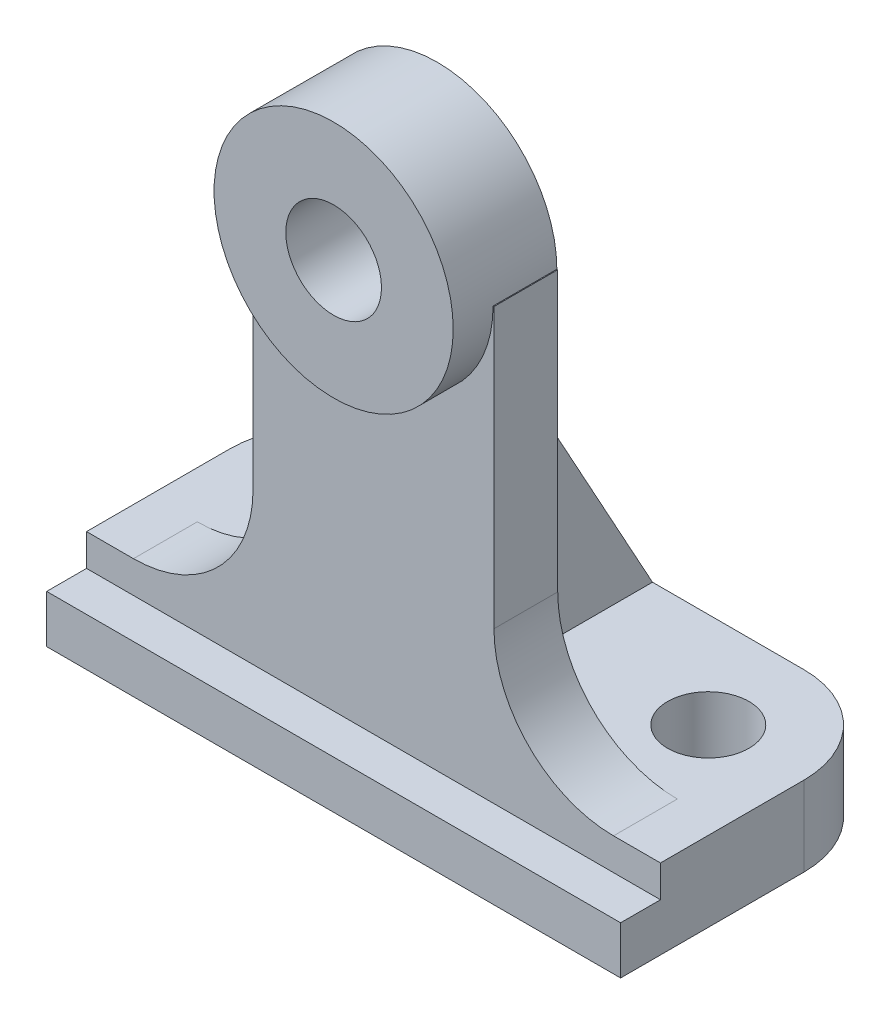
ISO-10303-21;
HEADER;
FILE_DESCRIPTION(('STEP AP214'),'2;1');
FILE_NAME('part.step','',(''),(''),'','','');
FILE_SCHEMA(('AUTOMOTIVE_DESIGN { 1 0 10303 214 1 1 1 1 }'));
ENDSEC;
DATA;
#1=APPLICATION_CONTEXT('core data for automotive mechanical design processes');
#2=APPLICATION_PROTOCOL_DEFINITION('international standard','automotive_design',2000,#1);
#3=PRODUCT_CONTEXT('',#1,'mechanical');
#4=PRODUCT('Part','Part','',(#3));
#5=PRODUCT_RELATED_PRODUCT_CATEGORY('part','',(#4));
#6=PRODUCT_DEFINITION_FORMATION('','',#4);
#7=PRODUCT_DEFINITION_CONTEXT('part definition',#1,'design');
#8=PRODUCT_DEFINITION('design','',#6,#7);
#9=PRODUCT_DEFINITION_SHAPE('','',#8);
#10=(LENGTH_UNIT() NAMED_UNIT(*) SI_UNIT(.MILLI.,.METRE.));
#11=(NAMED_UNIT(*) PLANE_ANGLE_UNIT() SI_UNIT($,.RADIAN.));
#12=(NAMED_UNIT(*) SI_UNIT($,.STERADIAN.) SOLID_ANGLE_UNIT());
#13=UNCERTAINTY_MEASURE_WITH_UNIT(LENGTH_MEASURE(1.E-05),#10,'distance_accuracy_value','');
#14=(GEOMETRIC_REPRESENTATION_CONTEXT(3) GLOBAL_UNCERTAINTY_ASSIGNED_CONTEXT((#13)) GLOBAL_UNIT_ASSIGNED_CONTEXT((#10,
#11,#12)) REPRESENTATION_CONTEXT('',''));
#15=CARTESIAN_POINT('',(0.,0.,0.));
#16=DIRECTION('',(0.,0.,1.));
#17=DIRECTION('',(1.,0.,0.));
#18=AXIS2_PLACEMENT_3D('',#15,#16,#17);
#19=CARTESIAN_POINT('',(-36.,5.,0.));
#20=DIRECTION('',(0.,1.,0.));
#21=DIRECTION('',(0.,0.,1.));
#22=AXIS2_PLACEMENT_3D('',#19,#20,#21);
#23=PLANE('',#22);
#24=CARTESIAN_POINT('',(-24.,5.,-5.5));
#25=DIRECTION('',(0.,1.,0.));
#26=DIRECTION('',(0.,0.,1.));
#27=AXIS2_PLACEMENT_3D('',#24,#25,#26);
#28=CIRCLE('',#27,5.1);
#29=CARTESIAN_POINT('',(-24.,5.,-0.400000000000001));
#30=VERTEX_POINT('',#29);
#31=EDGE_CURVE('E204',#30,#30,#28,.T.);
#32=ORIENTED_EDGE('',*,*,#31,.F.);
#33=EDGE_LOOP('',(#32));
#34=FACE_BOUND('',#33,.T.);
#35=DIRECTION('',(-1.,0.,0.));
#36=VECTOR('',#35,1.);
#37=CARTESIAN_POINT('',(0.,5.,4.5));
#38=LINE('',#37,#36);
#39=CARTESIAN_POINT('',(-5.,5.,4.5));
#40=VERTEX_POINT('',#39);
#41=CARTESIAN_POINT('',(-30.1114372983065,5.,4.5));
#42=VERTEX_POINT('',#41);
#43=EDGE_CURVE('E236',#40,#42,#38,.T.);
#44=ORIENTED_EDGE('',*,*,#43,.F.);
#45=DIRECTION('',(0.,0.,-1.));
#46=VECTOR('',#45,1.);
#47=CARTESIAN_POINT('',(-5.,5.,0.));
#48=LINE('',#47,#46);
#49=CARTESIAN_POINT('',(-5.,5.,-17.5));
#50=VERTEX_POINT('',#49);
#51=EDGE_CURVE('E65',#40,#50,#48,.T.);
#52=ORIENTED_EDGE('',*,*,#51,.T.);
#53=DIRECTION('',(1.,0.,0.));
#54=VECTOR('',#53,1.);
#55=CARTESIAN_POINT('',(-36.,5.,-17.5));
#56=LINE('',#55,#54);
#57=CARTESIAN_POINT('',(-24.,5.,-17.5));
#58=VERTEX_POINT('',#57);
#59=EDGE_CURVE('E289',#58,#50,#56,.T.);
#60=ORIENTED_EDGE('',*,*,#59,.F.);
#61=CARTESIAN_POINT('',(-24.,5.,-5.5));
#62=DIRECTION('',(0.,1.,0.));
#63=DIRECTION('',(0.,0.,1.));
#64=AXIS2_PLACEMENT_3D('',#61,#62,#63);
#65=CIRCLE('',#64,12.);
#66=CARTESIAN_POINT('',(-36.,5.,-5.5));
#67=VERTEX_POINT('',#66);
#68=EDGE_CURVE('E325',#58,#67,#65,.T.);
#69=ORIENTED_EDGE('',*,*,#68,.T.);
#70=DIRECTION('',(0.,0.,1.));
#71=VECTOR('',#70,1.);
#72=CARTESIAN_POINT('',(-36.,5.,0.));
#73=LINE('',#72,#71);
#74=CARTESIAN_POINT('',(-36.,5.,12.5));
#75=VERTEX_POINT('',#74);
#76=EDGE_CURVE('E277',#67,#75,#73,.T.);
#77=ORIENTED_EDGE('',*,*,#76,.T.);
#78=DIRECTION('',(1.,0.,0.));
#79=VECTOR('',#78,1.);
#80=CARTESIAN_POINT('',(-36.,5.,12.5));
#81=LINE('',#80,#79);
#82=CARTESIAN_POINT('',(-30.1114372983065,5.,12.5));
#83=VERTEX_POINT('',#82);
#84=EDGE_CURVE('E300',#75,#83,#81,.T.);
#85=ORIENTED_EDGE('',*,*,#84,.T.);
#86=DIRECTION('',(0.,0.,1.));
#87=VECTOR('',#86,1.);
#88=CARTESIAN_POINT('',(-30.1114372983065,5.,4.5));
#89=LINE('',#88,#87);
#90=EDGE_CURVE('E308',#83,#42,#89,.F.);
#91=ORIENTED_EDGE('',*,*,#90,.T.);
#92=EDGE_LOOP('',(#44,#52,#60,#69,#77,#85,#91));
#93=FACE_BOUND('',#92,.T.);
#94=ADVANCED_FACE('F42',(#34,#93),#23,.T.);
#95=CARTESIAN_POINT('',(-36.,0.,12.5));
#96=DIRECTION('',(0.,0.,1.));
#97=DIRECTION('',(1.,0.,0.));
#98=AXIS2_PLACEMENT_3D('',#95,#96,#97);
#99=PLANE('',#98);
#100=DIRECTION('',(-1.,0.,0.));
#101=VECTOR('',#100,1.);
#102=CARTESIAN_POINT('',(0.,55.,12.5));
#103=LINE('',#102,#101);
#104=CARTESIAN_POINT('',(15.1114372983064,55.,12.5));
#105=VERTEX_POINT('',#104);
#106=CARTESIAN_POINT('',(15.,55.,12.5));
#107=VERTEX_POINT('',#106);
#108=EDGE_CURVE('E229',#105,#107,#103,.T.);
#109=ORIENTED_EDGE('',*,*,#108,.T.);
#110=CARTESIAN_POINT('',(0.,55.,12.5));
#111=DIRECTION('',(0.,0.,1.));
#112=DIRECTION('',(1.,0.,0.));
#113=AXIS2_PLACEMENT_3D('',#110,#111,#112);
#114=CIRCLE('',#113,15.);
#115=CARTESIAN_POINT('',(-15.,55.,12.5));
#116=VERTEX_POINT('',#115);
#117=EDGE_CURVE('E219',#116,#107,#114,.T.);
#118=ORIENTED_EDGE('',*,*,#117,.F.);
#119=CARTESIAN_POINT('',(-15.1114372983065,55.,12.5));
#120=VERTEX_POINT('',#119);
#121=EDGE_CURVE('E223',#116,#120,#103,.T.);
#122=ORIENTED_EDGE('',*,*,#121,.T.);
#123=DIRECTION('',(0.,-1.,0.));
#124=VECTOR('',#123,1.);
#125=CARTESIAN_POINT('',(-15.1114372983065,0.,12.5));
#126=LINE('',#125,#124);
#127=CARTESIAN_POINT('',(-15.1114372983065,20.,12.5));
#128=VERTEX_POINT('',#127);
#129=EDGE_CURVE('E248',#120,#128,#126,.T.);
#130=ORIENTED_EDGE('',*,*,#129,.T.);
#131=CARTESIAN_POINT('',(-30.1114372983065,20.,12.5));
#132=DIRECTION('',(0.,0.,1.));
#133=DIRECTION('',(1.,0.,0.));
#134=AXIS2_PLACEMENT_3D('',#131,#132,#133);
#135=CIRCLE('',#134,15.);
#136=EDGE_CURVE('E313',#128,#83,#135,.F.);
#137=ORIENTED_EDGE('',*,*,#136,.T.);
#138=ORIENTED_EDGE('',*,*,#84,.F.);
#139=DIRECTION('',(0.,-1.,0.));
#140=VECTOR('',#139,1.);
#141=CARTESIAN_POINT('',(-36.,0.,12.5));
#142=LINE('',#141,#140);
#143=CARTESIAN_POINT('',(-36.,1.,12.5));
#144=VERTEX_POINT('',#143);
#145=EDGE_CURVE('E279',#75,#144,#142,.T.);
#146=ORIENTED_EDGE('',*,*,#145,.T.);
#147=DIRECTION('',(1.,0.,0.));
#148=VECTOR('',#147,1.);
#149=CARTESIAN_POINT('',(-36.,1.,12.5));
#150=LINE('',#149,#148);
#151=CARTESIAN_POINT('',(36.,1.,12.5));
#152=VERTEX_POINT('',#151);
#153=EDGE_CURVE('E298',#144,#152,#150,.T.);
#154=ORIENTED_EDGE('',*,*,#153,.T.);
#155=DIRECTION('',(0.,-1.,0.));
#156=VECTOR('',#155,1.);
#157=CARTESIAN_POINT('',(36.,0.,12.5));
#158=LINE('',#157,#156);
#159=CARTESIAN_POINT('',(36.,5.,12.5));
#160=VERTEX_POINT('',#159);
#161=EDGE_CURVE('E265',#160,#152,#158,.T.);
#162=ORIENTED_EDGE('',*,*,#161,.F.);
#163=CARTESIAN_POINT('',(30.1114372983065,5.,12.5));
#164=VERTEX_POINT('',#163);
#165=EDGE_CURVE('E288',#164,#160,#81,.T.);
#166=ORIENTED_EDGE('',*,*,#165,.F.);
#167=CARTESIAN_POINT('',(30.1114372983065,20.,12.5));
#168=DIRECTION('',(0.,0.,1.));
#169=DIRECTION('',(1.,0.,0.));
#170=AXIS2_PLACEMENT_3D('',#167,#168,#169);
#171=CIRCLE('',#170,15.);
#172=CARTESIAN_POINT('',(15.1114372983065,20.,12.5));
#173=VERTEX_POINT('',#172);
#174=EDGE_CURVE('E317',#164,#173,#171,.F.);
#175=ORIENTED_EDGE('',*,*,#174,.T.);
#176=DIRECTION('',(0.,-1.,0.));
#177=VECTOR('',#176,1.);
#178=CARTESIAN_POINT('',(15.1114372983065,0.,12.5));
#179=LINE('',#178,#177);
#180=EDGE_CURVE('E251',#105,#173,#179,.T.);
#181=ORIENTED_EDGE('',*,*,#180,.F.);
#182=EDGE_LOOP('',(#109,#118,#122,#130,#137,#138,#146,#154,#162,#166,#175,#181));
#183=FACE_BOUND('',#182,.T.);
#184=ADVANCED_FACE('F379',(#183),#99,.T.);
#185=DIRECTION('',(0.,0.,-1.));
#186=VECTOR('',#185,1.);
#187=CARTESIAN_POINT('',(5.,5.,0.));
#188=LINE('',#187,#186);
#189=CARTESIAN_POINT('',(5.,5.,4.5));
#190=VERTEX_POINT('',#189);
#191=CARTESIAN_POINT('',(5.,5.,-17.5));
#192=VERTEX_POINT('',#191);
#193=EDGE_CURVE('E191',#190,#192,#188,.T.);
#194=ORIENTED_EDGE('',*,*,#193,.F.);
#195=CARTESIAN_POINT('',(30.1114372983065,5.,4.5));
#196=VERTEX_POINT('',#195);
#197=EDGE_CURVE('E237',#196,#190,#38,.T.);
#198=ORIENTED_EDGE('',*,*,#197,.F.);
#199=DIRECTION('',(0.,0.,1.));
#200=VECTOR('',#199,1.);
#201=CARTESIAN_POINT('',(30.1114372983065,5.,0.));
#202=LINE('',#201,#200);
#203=EDGE_CURVE('E305',#196,#164,#202,.T.);
#204=ORIENTED_EDGE('',*,*,#203,.T.);
#205=ORIENTED_EDGE('',*,*,#165,.T.);
#206=DIRECTION('',(0.,0.,1.));
#207=VECTOR('',#206,1.);
#208=CARTESIAN_POINT('',(36.,5.,0.));
#209=LINE('',#208,#207);
#210=CARTESIAN_POINT('',(36.,5.,-5.5));
#211=VERTEX_POINT('',#210);
#212=EDGE_CURVE('E257',#211,#160,#209,.T.);
#213=ORIENTED_EDGE('',*,*,#212,.F.);
#214=CARTESIAN_POINT('',(24.,5.,-5.5));
#215=DIRECTION('',(0.,1.,0.));
#216=DIRECTION('',(0.,0.,1.));
#217=AXIS2_PLACEMENT_3D('',#214,#215,#216);
#218=CIRCLE('',#217,12.);
#219=CARTESIAN_POINT('',(24.,5.,-17.5));
#220=VERTEX_POINT('',#219);
#221=EDGE_CURVE('E327',#211,#220,#218,.T.);
#222=ORIENTED_EDGE('',*,*,#221,.T.);
#223=EDGE_CURVE('E57',#192,#220,#56,.T.);
#224=ORIENTED_EDGE('',*,*,#223,.F.);
#225=EDGE_LOOP('',(#194,#198,#204,#205,#213,#222,#224));
#226=FACE_BOUND('',#225,.T.);
#227=CARTESIAN_POINT('',(24.,5.,-5.5));
#228=DIRECTION('',(0.,1.,0.));
#229=DIRECTION('',(0.,0.,1.));
#230=AXIS2_PLACEMENT_3D('',#227,#228,#229);
#231=CIRCLE('',#230,5.1);
#232=CARTESIAN_POINT('',(24.,5.,-0.400000000000001));
#233=VERTEX_POINT('',#232);
#234=EDGE_CURVE('E210',#233,#233,#231,.T.);
#235=ORIENTED_EDGE('',*,*,#234,.F.);
#236=EDGE_LOOP('',(#235));
#237=FACE_BOUND('',#236,.T.);
#238=ADVANCED_FACE('F352',(#226,#237),#23,.T.);
#239=CARTESIAN_POINT('',(-36.,0.,-17.5));
#240=DIRECTION('',(0.,0.,-1.));
#241=DIRECTION('',(-1.,0.,0.));
#242=AXIS2_PLACEMENT_3D('',#239,#240,#241);
#243=PLANE('',#242);
#244=DIRECTION('',(0.,1.,0.));
#245=VECTOR('',#244,1.);
#246=CARTESIAN_POINT('',(24.,0.,-17.5));
#247=LINE('',#246,#245);
#248=CARTESIAN_POINT('',(24.,-5.,-17.5));
#249=VERTEX_POINT('',#248);
#250=EDGE_CURVE('E332',#220,#249,#247,.F.);
#251=ORIENTED_EDGE('',*,*,#250,.T.);
#252=DIRECTION('',(1.,0.,0.));
#253=VECTOR('',#252,1.);
#254=CARTESIAN_POINT('',(-36.,-5.,-17.5));
#255=LINE('',#254,#253);
#256=CARTESIAN_POINT('',(-24.,-5.,-17.5));
#257=VERTEX_POINT('',#256);
#258=EDGE_CURVE('E292',#257,#249,#255,.T.);
#259=ORIENTED_EDGE('',*,*,#258,.F.);
#260=DIRECTION('',(0.,1.,0.));
#261=VECTOR('',#260,1.);
#262=CARTESIAN_POINT('',(-24.,5.,-17.5));
#263=LINE('',#262,#261);
#264=EDGE_CURVE('E329',#257,#58,#263,.T.);
#265=ORIENTED_EDGE('',*,*,#264,.T.);
#266=ORIENTED_EDGE('',*,*,#59,.T.);
#267=DIRECTION('',(1.,0.,0.));
#268=VECTOR('',#267,1.);
#269=CARTESIAN_POINT('',(-36.,5.,-17.5));
#270=LINE('',#269,#268);
#271=EDGE_CURVE('E185',#50,#192,#270,.T.);
#272=ORIENTED_EDGE('',*,*,#271,.T.);
#273=ORIENTED_EDGE('',*,*,#223,.T.);
#274=EDGE_LOOP('',(#251,#259,#265,#266,#272,#273));
#275=FACE_BOUND('',#274,.T.);
#276=ADVANCED_FACE('F373',(#275),#243,.T.);
#277=CARTESIAN_POINT('',(-36.,-5.,0.));
#278=DIRECTION('',(0.,1.,0.));
#279=DIRECTION('',(0.,0.,1.));
#280=AXIS2_PLACEMENT_3D('',#277,#278,#279);
#281=PLANE('',#280);
#282=CARTESIAN_POINT('',(24.,-5.,-5.5));
#283=DIRECTION('',(0.,1.,0.));
#284=DIRECTION('',(0.,0.,1.));
#285=AXIS2_PLACEMENT_3D('',#282,#283,#284);
#286=CIRCLE('',#285,5.1);
#287=CARTESIAN_POINT('',(24.,-5.,-0.400000000000005));
#288=VERTEX_POINT('',#287);
#289=EDGE_CURVE('E213',#288,#288,#286,.T.);
#290=ORIENTED_EDGE('',*,*,#289,.T.);
#291=EDGE_LOOP('',(#290));
#292=FACE_BOUND('',#291,.T.);
#293=DIRECTION('',(0.,0.,1.));
#294=VECTOR('',#293,1.);
#295=CARTESIAN_POINT('',(36.,-5.,0.));
#296=LINE('',#295,#294);
#297=CARTESIAN_POINT('',(36.,-5.,-5.5));
#298=VERTEX_POINT('',#297);
#299=CARTESIAN_POINT('',(36.,-5.,17.5));
#300=VERTEX_POINT('',#299);
#301=EDGE_CURVE('E274',#298,#300,#296,.T.);
#302=ORIENTED_EDGE('',*,*,#301,.T.);
#303=DIRECTION('',(1.,0.,0.));
#304=VECTOR('',#303,1.);
#305=CARTESIAN_POINT('',(-36.,-5.,17.5));
#306=LINE('',#305,#304);
#307=CARTESIAN_POINT('',(-36.,-5.,17.5));
#308=VERTEX_POINT('',#307);
#309=EDGE_CURVE('E294',#308,#300,#306,.T.);
#310=ORIENTED_EDGE('',*,*,#309,.F.);
#311=DIRECTION('',(0.,0.,1.));
#312=VECTOR('',#311,1.);
#313=CARTESIAN_POINT('',(-36.,-5.,0.));
#314=LINE('',#313,#312);
#315=CARTESIAN_POINT('',(-36.,-5.,-5.5));
#316=VERTEX_POINT('',#315);
#317=EDGE_CURVE('E286',#316,#308,#314,.T.);
#318=ORIENTED_EDGE('',*,*,#317,.F.);
#319=CARTESIAN_POINT('',(-24.,-5.,-5.5));
#320=DIRECTION('',(0.,1.,0.));
#321=DIRECTION('',(0.,0.,1.));
#322=AXIS2_PLACEMENT_3D('',#319,#320,#321);
#323=CIRCLE('',#322,12.);
#324=EDGE_CURVE('E335',#316,#257,#323,.F.);
#325=ORIENTED_EDGE('',*,*,#324,.T.);
#326=ORIENTED_EDGE('',*,*,#258,.T.);
#327=CARTESIAN_POINT('',(24.,-5.,-5.5));
#328=DIRECTION('',(0.,1.,0.));
#329=DIRECTION('',(0.,0.,1.));
#330=AXIS2_PLACEMENT_3D('',#327,#328,#329);
#331=CIRCLE('',#330,12.);
#332=EDGE_CURVE('E50',#249,#298,#331,.F.);
#333=ORIENTED_EDGE('',*,*,#332,.T.);
#334=EDGE_LOOP('',(#302,#310,#318,#325,#326,#333));
#335=FACE_BOUND('',#334,.T.);
#336=CARTESIAN_POINT('',(-24.,-5.,-5.5));
#337=DIRECTION('',(0.,1.,0.));
#338=DIRECTION('',(0.,0.,1.));
#339=AXIS2_PLACEMENT_3D('',#336,#337,#338);
#340=CIRCLE('',#339,5.1);
#341=CARTESIAN_POINT('',(-24.,-5.,-0.400000000000005));
#342=VERTEX_POINT('',#341);
#343=EDGE_CURVE('E207',#342,#342,#340,.T.);
#344=ORIENTED_EDGE('',*,*,#343,.T.);
#345=EDGE_LOOP('',(#344));
#346=FACE_BOUND('',#345,.T.);
#347=ADVANCED_FACE('F339',(#292,#335,#346),#281,.F.);
#348=CARTESIAN_POINT('',(-36.,0.,17.5));
#349=DIRECTION('',(0.,0.,-1.));
#350=DIRECTION('',(-1.,0.,0.));
#351=AXIS2_PLACEMENT_3D('',#348,#349,#350);
#352=PLANE('',#351);
#353=DIRECTION('',(0.,1.,0.));
#354=VECTOR('',#353,1.);
#355=CARTESIAN_POINT('',(36.,0.,17.5));
#356=LINE('',#355,#354);
#357=CARTESIAN_POINT('',(36.,1.,17.5));
#358=VERTEX_POINT('',#357);
#359=EDGE_CURVE('E271',#300,#358,#356,.T.);
#360=ORIENTED_EDGE('',*,*,#359,.T.);
#361=DIRECTION('',(1.,0.,0.));
#362=VECTOR('',#361,1.);
#363=CARTESIAN_POINT('',(-36.,1.,17.5));
#364=LINE('',#363,#362);
#365=CARTESIAN_POINT('',(-36.,1.,17.5));
#366=VERTEX_POINT('',#365);
#367=EDGE_CURVE('E296',#366,#358,#364,.T.);
#368=ORIENTED_EDGE('',*,*,#367,.F.);
#369=DIRECTION('',(0.,1.,0.));
#370=VECTOR('',#369,1.);
#371=CARTESIAN_POINT('',(-36.,0.,17.5));
#372=LINE('',#371,#370);
#373=EDGE_CURVE('E284',#308,#366,#372,.T.);
#374=ORIENTED_EDGE('',*,*,#373,.F.);
#375=ORIENTED_EDGE('',*,*,#309,.T.);
#376=EDGE_LOOP('',(#360,#368,#374,#375));
#377=FACE_BOUND('',#376,.T.);
#378=ADVANCED_FACE('F365',(#377),#352,.F.);
#379=CARTESIAN_POINT('',(-36.,1.,0.));
#380=DIRECTION('',(0.,-1.,0.));
#381=DIRECTION('',(0.,0.,-1.));
#382=AXIS2_PLACEMENT_3D('',#379,#380,#381);
#383=PLANE('',#382);
#384=DIRECTION('',(0.,0.,-1.));
#385=VECTOR('',#384,1.);
#386=CARTESIAN_POINT('',(36.,1.,0.));
#387=LINE('',#386,#385);
#388=EDGE_CURVE('E268',#358,#152,#387,.T.);
#389=ORIENTED_EDGE('',*,*,#388,.T.);
#390=ORIENTED_EDGE('',*,*,#153,.F.);
#391=DIRECTION('',(0.,0.,-1.));
#392=VECTOR('',#391,1.);
#393=CARTESIAN_POINT('',(-36.,1.,0.));
#394=LINE('',#393,#392);
#395=EDGE_CURVE('E282',#366,#144,#394,.T.);
#396=ORIENTED_EDGE('',*,*,#395,.F.);
#397=ORIENTED_EDGE('',*,*,#367,.T.);
#398=EDGE_LOOP('',(#389,#390,#396,#397));
#399=FACE_BOUND('',#398,.T.);
#400=ADVANCED_FACE('F360',(#399),#383,.F.);
#401=CARTESIAN_POINT('',(-36.,0.,0.));
#402=DIRECTION('',(1.,0.,0.));
#403=DIRECTION('',(0.,0.,-1.));
#404=AXIS2_PLACEMENT_3D('',#401,#402,#403);
#405=PLANE('',#404);
#406=ORIENTED_EDGE('',*,*,#76,.F.);
#407=DIRECTION('',(0.,1.,0.));
#408=VECTOR('',#407,1.);
#409=CARTESIAN_POINT('',(-36.,-5.,-5.5));
#410=LINE('',#409,#408);
#411=EDGE_CURVE('E11',#67,#316,#410,.F.);
#412=ORIENTED_EDGE('',*,*,#411,.T.);
#413=ORIENTED_EDGE('',*,*,#317,.T.);
#414=ORIENTED_EDGE('',*,*,#373,.T.);
#415=ORIENTED_EDGE('',*,*,#395,.T.);
#416=ORIENTED_EDGE('',*,*,#145,.F.);
#417=EDGE_LOOP('',(#406,#412,#413,#414,#415,#416));
#418=FACE_BOUND('',#417,.T.);
#419=ADVANCED_FACE('F377',(#418),#405,.F.);
#420=CARTESIAN_POINT('',(36.,0.,0.));
#421=DIRECTION('',(1.,0.,0.));
#422=DIRECTION('',(0.,0.,-1.));
#423=AXIS2_PLACEMENT_3D('',#420,#421,#422);
#424=PLANE('',#423);
#425=ORIENTED_EDGE('',*,*,#301,.F.);
#426=DIRECTION('',(0.,1.,0.));
#427=VECTOR('',#426,1.);
#428=CARTESIAN_POINT('',(36.,0.,-5.5));
#429=LINE('',#428,#427);
#430=EDGE_CURVE('E322',#298,#211,#429,.T.);
#431=ORIENTED_EDGE('',*,*,#430,.T.);
#432=ORIENTED_EDGE('',*,*,#212,.T.);
#433=ORIENTED_EDGE('',*,*,#161,.T.);
#434=ORIENTED_EDGE('',*,*,#388,.F.);
#435=ORIENTED_EDGE('',*,*,#359,.F.);
#436=EDGE_LOOP('',(#425,#431,#432,#433,#434,#435));
#437=FACE_BOUND('',#436,.T.);
#438=ADVANCED_FACE('F348',(#437),#424,.T.);
#439=CARTESIAN_POINT('',(0.,55.,4.5));
#440=DIRECTION('',(0.,0.,1.));
#441=DIRECTION('',(1.,0.,0.));
#442=AXIS2_PLACEMENT_3D('',#439,#440,#441);
#443=CYLINDRICAL_SURFACE('',#442,15.);
#444=CARTESIAN_POINT('',(0.,55.,17.5));
#445=DIRECTION('',(0.,0.,1.));
#446=DIRECTION('',(1.,0.,0.));
#447=AXIS2_PLACEMENT_3D('',#444,#445,#446);
#448=CIRCLE('',#447,15.);
#449=CARTESIAN_POINT('',(15.,55.,17.5));
#450=VERTEX_POINT('',#449);
#451=EDGE_CURVE('E220',#450,#450,#448,.T.);
#452=ORIENTED_EDGE('',*,*,#451,.F.);
#453=EDGE_LOOP('',(#452));
#454=FACE_BOUND('',#453,.T.);
#455=ORIENTED_EDGE('',*,*,#117,.T.);
#456=DIRECTION('',(0.,0.,1.));
#457=VECTOR('',#456,1.);
#458=CARTESIAN_POINT('',(15.,55.,4.5));
#459=LINE('',#458,#457);
#460=CARTESIAN_POINT('',(15.,55.,4.5));
#461=VERTEX_POINT('',#460);
#462=EDGE_CURVE('E254',#461,#107,#459,.T.);
#463=ORIENTED_EDGE('',*,*,#462,.F.);
#464=CARTESIAN_POINT('',(0.,55.,4.5));
#465=DIRECTION('',(0.,0.,1.));
#466=DIRECTION('',(1.,0.,0.));
#467=AXIS2_PLACEMENT_3D('',#464,#465,#466);
#468=CIRCLE('',#467,15.);
#469=CARTESIAN_POINT('',(-15.,55.,4.5));
#470=VERTEX_POINT('',#469);
#471=EDGE_CURVE('E225',#461,#470,#468,.T.);
#472=ORIENTED_EDGE('',*,*,#471,.T.);
#473=DIRECTION('',(0.,0.,1.));
#474=VECTOR('',#473,1.);
#475=CARTESIAN_POINT('',(-15.,55.,4.5));
#476=LINE('',#475,#474);
#477=EDGE_CURVE('E245',#470,#116,#476,.T.);
#478=ORIENTED_EDGE('',*,*,#477,.T.);
#479=EDGE_LOOP('',(#455,#463,#472,#478));
#480=FACE_BOUND('',#479,.T.);
#481=ADVANCED_FACE('F396',(#454,#480),#443,.T.);
#482=CARTESIAN_POINT('',(0.,55.,4.5));
#483=DIRECTION('',(0.,1.,0.));
#484=DIRECTION('',(-1.,0.,0.));
#485=AXIS2_PLACEMENT_3D('',#482,#483,#484);
#486=PLANE('',#485);
#487=ORIENTED_EDGE('',*,*,#108,.F.);
#488=DIRECTION('',(0.,0.,1.));
#489=VECTOR('',#488,1.);
#490=CARTESIAN_POINT('',(15.1114372983064,55.,4.5));
#491=LINE('',#490,#489);
#492=CARTESIAN_POINT('',(15.1114372983064,55.,4.5));
#493=VERTEX_POINT('',#492);
#494=EDGE_CURVE('E258',#493,#105,#491,.T.);
#495=ORIENTED_EDGE('',*,*,#494,.F.);
#496=DIRECTION('',(-1.,0.,0.));
#497=VECTOR('',#496,1.);
#498=CARTESIAN_POINT('',(0.,55.,4.5));
#499=LINE('',#498,#497);
#500=EDGE_CURVE('E233',#493,#461,#499,.T.);
#501=ORIENTED_EDGE('',*,*,#500,.T.);
#502=ORIENTED_EDGE('',*,*,#462,.T.);
#503=EDGE_LOOP('',(#487,#495,#501,#502));
#504=FACE_BOUND('',#503,.T.);
#505=ADVANCED_FACE('F400',(#504),#486,.T.);
#506=CARTESIAN_POINT('',(15.1114372983065,0.,4.5));
#507=DIRECTION('',(-1.,0.,0.));
#508=DIRECTION('',(0.,-1.,0.));
#509=AXIS2_PLACEMENT_3D('',#506,#507,#508);
#510=PLANE('',#509);
#511=ORIENTED_EDGE('',*,*,#180,.T.);
#512=DIRECTION('',(0.,0.,1.));
#513=VECTOR('',#512,1.);
#514=CARTESIAN_POINT('',(15.1114372983065,20.,4.5));
#515=LINE('',#514,#513);
#516=CARTESIAN_POINT('',(15.1114372983065,20.,4.5));
#517=VERTEX_POINT('',#516);
#518=EDGE_CURVE('E311',#173,#517,#515,.F.);
#519=ORIENTED_EDGE('',*,*,#518,.T.);
#520=DIRECTION('',(0.,-1.,0.));
#521=VECTOR('',#520,1.);
#522=CARTESIAN_POINT('',(15.1114372983065,0.,4.5));
#523=LINE('',#522,#521);
#524=EDGE_CURVE('E239',#493,#517,#523,.T.);
#525=ORIENTED_EDGE('',*,*,#524,.F.);
#526=ORIENTED_EDGE('',*,*,#494,.T.);
#527=EDGE_LOOP('',(#511,#519,#525,#526));
#528=FACE_BOUND('',#527,.T.);
#529=ADVANCED_FACE('F404',(#528),#510,.F.);
#530=CARTESIAN_POINT('',(-15.1114372983065,0.,4.5));
#531=DIRECTION('',(-1.,0.,0.));
#532=DIRECTION('',(0.,-1.,0.));
#533=AXIS2_PLACEMENT_3D('',#530,#531,#532);
#534=PLANE('',#533);
#535=DIRECTION('',(0.,-1.,0.));
#536=VECTOR('',#535,1.);
#537=CARTESIAN_POINT('',(-15.1114372983065,0.,4.5));
#538=LINE('',#537,#536);
#539=CARTESIAN_POINT('',(-15.1114372983065,55.,4.5));
#540=VERTEX_POINT('',#539);
#541=CARTESIAN_POINT('',(-15.1114372983065,20.,4.5));
#542=VERTEX_POINT('',#541);
#543=EDGE_CURVE('E232',#540,#542,#538,.T.);
#544=ORIENTED_EDGE('',*,*,#543,.T.);
#545=DIRECTION('',(0.,0.,1.));
#546=VECTOR('',#545,1.);
#547=CARTESIAN_POINT('',(-15.1114372983065,20.,12.5));
#548=LINE('',#547,#546);
#549=EDGE_CURVE('E291',#542,#128,#548,.T.);
#550=ORIENTED_EDGE('',*,*,#549,.T.);
#551=ORIENTED_EDGE('',*,*,#129,.F.);
#552=DIRECTION('',(0.,0.,1.));
#553=VECTOR('',#552,1.);
#554=CARTESIAN_POINT('',(-15.1114372983065,55.,4.5));
#555=LINE('',#554,#553);
#556=EDGE_CURVE('E260',#540,#120,#555,.T.);
#557=ORIENTED_EDGE('',*,*,#556,.F.);
#558=EDGE_LOOP('',(#544,#550,#551,#557));
#559=FACE_BOUND('',#558,.T.);
#560=ADVANCED_FACE('F388',(#559),#534,.T.);
#561=ORIENTED_EDGE('',*,*,#121,.F.);
#562=ORIENTED_EDGE('',*,*,#477,.F.);
#563=EDGE_CURVE('E228',#470,#540,#499,.T.);
#564=ORIENTED_EDGE('',*,*,#563,.T.);
#565=ORIENTED_EDGE('',*,*,#556,.T.);
#566=EDGE_LOOP('',(#561,#562,#564,#565));
#567=FACE_BOUND('',#566,.T.);
#568=ADVANCED_FACE('F391',(#567),#486,.T.);
#569=CARTESIAN_POINT('',(0.,55.,4.5));
#570=DIRECTION('',(0.,0.,1.));
#571=DIRECTION('',(1.,0.,0.));
#572=AXIS2_PLACEMENT_3D('',#569,#570,#571);
#573=CYLINDRICAL_SURFACE('',#572,6.);
#574=CARTESIAN_POINT('',(0.,55.,17.5));
#575=DIRECTION('',(0.,0.,-1.));
#576=DIRECTION('',(-1.,0.,0.));
#577=AXIS2_PLACEMENT_3D('',#574,#575,#576);
#578=CIRCLE('',#577,6.);
#579=CARTESIAN_POINT('',(-6.00000000000001,55.,17.5));
#580=VERTEX_POINT('',#579);
#581=EDGE_CURVE('E216',#580,#580,#578,.T.);
#582=ORIENTED_EDGE('',*,*,#581,.F.);
#583=EDGE_LOOP('',(#582));
#584=FACE_BOUND('',#583,.T.);
#585=CARTESIAN_POINT('',(0.,55.,4.5));
#586=DIRECTION('',(0.,0.,1.));
#587=DIRECTION('',(1.,0.,0.));
#588=AXIS2_PLACEMENT_3D('',#585,#586,#587);
#589=CIRCLE('',#588,6.);
#590=CARTESIAN_POINT('',(5.99999999999999,55.,4.5));
#591=VERTEX_POINT('',#590);
#592=EDGE_CURVE('E242',#591,#591,#589,.T.);
#593=ORIENTED_EDGE('',*,*,#592,.F.);
#594=EDGE_LOOP('',(#593));
#595=FACE_BOUND('',#594,.T.);
#596=ADVANCED_FACE('F464',(#584,#595),#573,.F.);
#597=CARTESIAN_POINT('',(0.,0.,4.5));
#598=DIRECTION('',(0.,0.,1.));
#599=DIRECTION('',(1.,0.,0.));
#600=AXIS2_PLACEMENT_3D('',#597,#598,#599);
#601=PLANE('',#600);
#602=ORIENTED_EDGE('',*,*,#197,.T.);
#603=DIRECTION('',(0.,1.,0.));
#604=VECTOR('',#603,1.);
#605=CARTESIAN_POINT('',(5.,0.,4.5));
#606=LINE('',#605,#604);
#607=CARTESIAN_POINT('',(5.,45.,4.5));
#608=VERTEX_POINT('',#607);
#609=EDGE_CURVE('E180',#190,#608,#606,.T.);
#610=ORIENTED_EDGE('',*,*,#609,.T.);
#611=DIRECTION('',(-1.,0.,0.));
#612=VECTOR('',#611,1.);
#613=CARTESIAN_POINT('',(0.,45.,4.5));
#614=LINE('',#613,#612);
#615=CARTESIAN_POINT('',(-5.,45.,4.5));
#616=VERTEX_POINT('',#615);
#617=EDGE_CURVE('E173',#608,#616,#614,.T.);
#618=ORIENTED_EDGE('',*,*,#617,.T.);
#619=DIRECTION('',(0.,1.,0.));
#620=VECTOR('',#619,1.);
#621=CARTESIAN_POINT('',(-5.,0.,4.5));
#622=LINE('',#621,#620);
#623=EDGE_CURVE('E178',#40,#616,#622,.T.);
#624=ORIENTED_EDGE('',*,*,#623,.F.);
#625=ORIENTED_EDGE('',*,*,#43,.T.);
#626=CARTESIAN_POINT('',(-30.1114372983065,20.,4.5));
#627=DIRECTION('',(0.,0.,1.));
#628=DIRECTION('',(1.,0.,0.));
#629=AXIS2_PLACEMENT_3D('',#626,#627,#628);
#630=CIRCLE('',#629,15.);
#631=EDGE_CURVE('E315',#42,#542,#630,.T.);
#632=ORIENTED_EDGE('',*,*,#631,.T.);
#633=ORIENTED_EDGE('',*,*,#543,.F.);
#634=ORIENTED_EDGE('',*,*,#563,.F.);
#635=ORIENTED_EDGE('',*,*,#471,.F.);
#636=ORIENTED_EDGE('',*,*,#500,.F.);
#637=ORIENTED_EDGE('',*,*,#524,.T.);
#638=CARTESIAN_POINT('',(30.1114372983065,20.,4.5));
#639=DIRECTION('',(0.,0.,1.));
#640=DIRECTION('',(1.,0.,0.));
#641=AXIS2_PLACEMENT_3D('',#638,#639,#640);
#642=CIRCLE('',#641,15.);
#643=EDGE_CURVE('E319',#517,#196,#642,.T.);
#644=ORIENTED_EDGE('',*,*,#643,.T.);
#645=EDGE_LOOP('',(#602,#610,#618,#624,#625,#632,#633,#634,#635,#636,#637,#644));
#646=FACE_BOUND('',#645,.T.);
#647=ORIENTED_EDGE('',*,*,#592,.T.);
#648=EDGE_LOOP('',(#647));
#649=FACE_BOUND('',#648,.T.);
#650=ADVANCED_FACE('F176',(#646,#649),#601,.F.);
#651=CARTESIAN_POINT('',(0.,55.,17.5));
#652=DIRECTION('',(0.,0.,1.));
#653=DIRECTION('',(1.,0.,0.));
#654=AXIS2_PLACEMENT_3D('',#651,#652,#653);
#655=PLANE('',#654);
#656=ORIENTED_EDGE('',*,*,#581,.T.);
#657=EDGE_LOOP('',(#656));
#658=FACE_BOUND('',#657,.T.);
#659=ORIENTED_EDGE('',*,*,#451,.T.);
#660=EDGE_LOOP('',(#659));
#661=FACE_BOUND('',#660,.T.);
#662=ADVANCED_FACE('F470',(#658,#661),#655,.T.);
#663=CARTESIAN_POINT('',(-30.1114372983065,20.,4.5));
#664=DIRECTION('',(0.,0.,-1.));
#665=DIRECTION('',(-1.,0.,0.));
#666=AXIS2_PLACEMENT_3D('',#663,#664,#665);
#667=CYLINDRICAL_SURFACE('',#666,15.);
#668=ORIENTED_EDGE('',*,*,#631,.F.);
#669=ORIENTED_EDGE('',*,*,#90,.F.);
#670=ORIENTED_EDGE('',*,*,#136,.F.);
#671=ORIENTED_EDGE('',*,*,#549,.F.);
#672=EDGE_LOOP('',(#668,#669,#670,#671));
#673=FACE_BOUND('',#672,.T.);
#674=ADVANCED_FACE('F383',(#673),#667,.F.);
#675=CARTESIAN_POINT('',(30.1114372983065,20.,0.));
#676=DIRECTION('',(0.,0.,1.));
#677=DIRECTION('',(1.,0.,0.));
#678=AXIS2_PLACEMENT_3D('',#675,#676,#677);
#679=CYLINDRICAL_SURFACE('',#678,15.);
#680=ORIENTED_EDGE('',*,*,#643,.F.);
#681=ORIENTED_EDGE('',*,*,#518,.F.);
#682=ORIENTED_EDGE('',*,*,#174,.F.);
#683=ORIENTED_EDGE('',*,*,#203,.F.);
#684=EDGE_LOOP('',(#680,#681,#682,#683));
#685=FACE_BOUND('',#684,.T.);
#686=ADVANCED_FACE('F408',(#685),#679,.F.);
#687=CARTESIAN_POINT('',(24.,0.,-5.5));
#688=DIRECTION('',(0.,1.,0.));
#689=DIRECTION('',(0.,0.,1.));
#690=AXIS2_PLACEMENT_3D('',#687,#688,#689);
#691=CYLINDRICAL_SURFACE('',#690,12.);
#692=ORIENTED_EDGE('',*,*,#332,.F.);
#693=ORIENTED_EDGE('',*,*,#250,.F.);
#694=ORIENTED_EDGE('',*,*,#221,.F.);
#695=ORIENTED_EDGE('',*,*,#430,.F.);
#696=EDGE_LOOP('',(#692,#693,#694,#695));
#697=FACE_BOUND('',#696,.T.);
#698=ADVANCED_FACE('F351',(#697),#691,.T.);
#699=CARTESIAN_POINT('',(-24.,0.,-5.5));
#700=DIRECTION('',(0.,-1.,0.));
#701=DIRECTION('',(0.,0.,-1.));
#702=AXIS2_PLACEMENT_3D('',#699,#700,#701);
#703=CYLINDRICAL_SURFACE('',#702,12.);
#704=ORIENTED_EDGE('',*,*,#324,.F.);
#705=ORIENTED_EDGE('',*,*,#411,.F.);
#706=ORIENTED_EDGE('',*,*,#68,.F.);
#707=ORIENTED_EDGE('',*,*,#264,.F.);
#708=EDGE_LOOP('',(#704,#705,#706,#707));
#709=FACE_BOUND('',#708,.T.);
#710=ADVANCED_FACE('F44',(#709),#703,.T.);
#711=CARTESIAN_POINT('',(24.,5.,-5.5));
#712=DIRECTION('',(0.,1.,0.));
#713=DIRECTION('',(0.,0.,1.));
#714=AXIS2_PLACEMENT_3D('',#711,#712,#713);
#715=CYLINDRICAL_SURFACE('',#714,5.1);
#716=ORIENTED_EDGE('',*,*,#289,.F.);
#717=EDGE_LOOP('',(#716));
#718=FACE_BOUND('',#717,.T.);
#719=ORIENTED_EDGE('',*,*,#234,.T.);
#720=EDGE_LOOP('',(#719));
#721=FACE_BOUND('',#720,.T.);
#722=ADVANCED_FACE('F474',(#718,#721),#715,.F.);
#723=CARTESIAN_POINT('',(-24.,5.,-5.5));
#724=DIRECTION('',(0.,1.,0.));
#725=DIRECTION('',(0.,0.,1.));
#726=AXIS2_PLACEMENT_3D('',#723,#724,#725);
#727=CYLINDRICAL_SURFACE('',#726,5.1);
#728=ORIENTED_EDGE('',*,*,#343,.F.);
#729=EDGE_LOOP('',(#728));
#730=FACE_BOUND('',#729,.T.);
#731=ORIENTED_EDGE('',*,*,#31,.T.);
#732=EDGE_LOOP('',(#731));
#733=FACE_BOUND('',#732,.T.);
#734=ADVANCED_FACE('F419',(#730,#733),#727,.F.);
#735=CARTESIAN_POINT('',(0.,5.,-17.5));
#736=DIRECTION('',(0.,0.481918749772156,-0.876215908676647));
#737=DIRECTION('',(0.,0.876215908676647,0.481918749772156));
#738=AXIS2_PLACEMENT_3D('',#735,#736,#737);
#739=PLANE('',#738);
#740=ORIENTED_EDGE('',*,*,#271,.F.);
#741=DIRECTION('',(0.,0.876215908676647,0.481918749772156));
#742=VECTOR('',#741,1.);
#743=CARTESIAN_POINT('',(-5.,5.,-17.5));
#744=LINE('',#743,#742);
#745=EDGE_CURVE('E190',#50,#616,#744,.T.);
#746=ORIENTED_EDGE('',*,*,#745,.T.);
#747=ORIENTED_EDGE('',*,*,#617,.F.);
#748=DIRECTION('',(0.,0.876215908676647,0.481918749772156));
#749=VECTOR('',#748,1.);
#750=CARTESIAN_POINT('',(5.,5.,-17.5));
#751=LINE('',#750,#749);
#752=EDGE_CURVE('E195',#192,#608,#751,.T.);
#753=ORIENTED_EDGE('',*,*,#752,.F.);
#754=EDGE_LOOP('',(#740,#746,#747,#753));
#755=FACE_BOUND('',#754,.T.);
#756=ADVANCED_FACE('F194',(#755),#739,.T.);
#757=CARTESIAN_POINT('',(5.,32.5,0.));
#758=DIRECTION('',(1.,0.,0.));
#759=DIRECTION('',(0.,0.,-1.));
#760=AXIS2_PLACEMENT_3D('',#757,#758,#759);
#761=PLANE('',#760);
#762=ORIENTED_EDGE('',*,*,#609,.F.);
#763=ORIENTED_EDGE('',*,*,#193,.T.);
#764=ORIENTED_EDGE('',*,*,#752,.T.);
#765=EDGE_LOOP('',(#762,#763,#764));
#766=FACE_BOUND('',#765,.T.);
#767=ADVANCED_FACE('F411',(#766),#761,.T.);
#768=CARTESIAN_POINT('',(-5.,32.5,0.));
#769=DIRECTION('',(1.,0.,0.));
#770=DIRECTION('',(0.,0.,-1.));
#771=AXIS2_PLACEMENT_3D('',#768,#769,#770);
#772=PLANE('',#771);
#773=ORIENTED_EDGE('',*,*,#51,.F.);
#774=ORIENTED_EDGE('',*,*,#623,.T.);
#775=ORIENTED_EDGE('',*,*,#745,.F.);
#776=EDGE_LOOP('',(#773,#774,#775));
#777=FACE_BOUND('',#776,.T.);
#778=ADVANCED_FACE('F189',(#777),#772,.F.);
#779=CLOSED_SHELL('',(#94,#184,#238,#276,#347,#378,#400,#419,#438,#481,#505,#529,#560,#568,#596,
#650,#662,#674,#686,#698,#710,#722,#734,#756,#767,#778));
#780=MANIFOLD_SOLID_BREP('B2',#779);
#781=ADVANCED_BREP_SHAPE_REPRESENTATION('',(#18,#780),#14);
#782=SHAPE_DEFINITION_REPRESENTATION(#9,#781);
ENDSEC;
END-ISO-10303-21;
